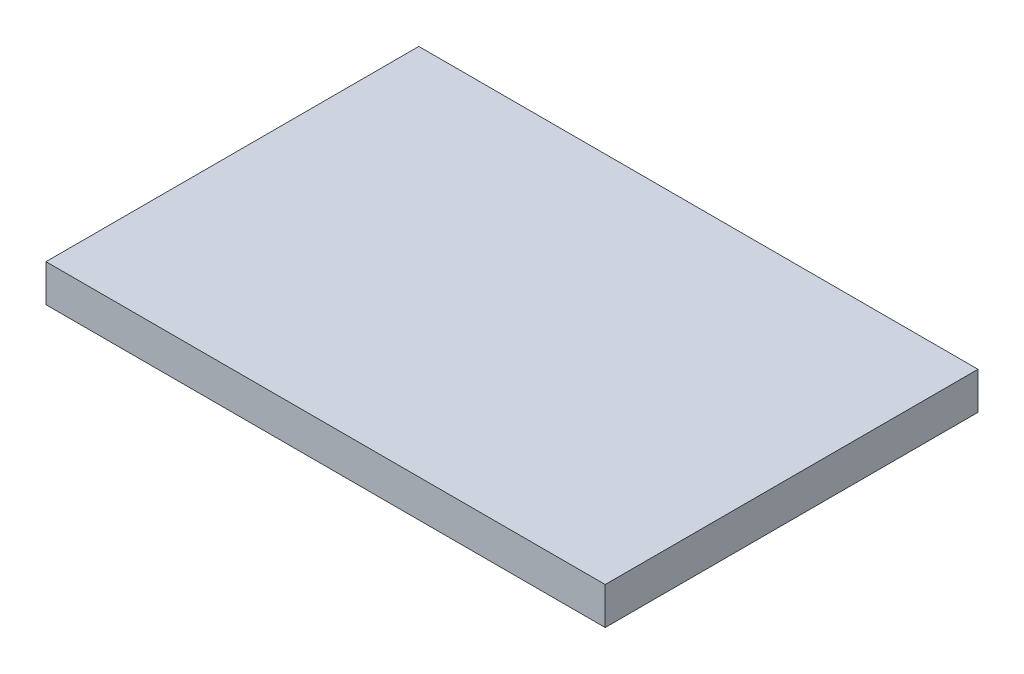
ISO-10303-21;
HEADER;
FILE_DESCRIPTION(('STEP AP214'),'2;1');
FILE_NAME('part.step','',(''),(''),'','','');
FILE_SCHEMA(('AUTOMOTIVE_DESIGN { 1 0 10303 214 1 1 1 1 }'));
ENDSEC;
DATA;
#1=APPLICATION_CONTEXT('core data for automotive mechanical design processes');
#2=APPLICATION_PROTOCOL_DEFINITION('international standard','automotive_design',2000,#1);
#3=PRODUCT_CONTEXT('',#1,'mechanical');
#4=PRODUCT('Part','Part','',(#3));
#5=PRODUCT_RELATED_PRODUCT_CATEGORY('part','',(#4));
#6=PRODUCT_DEFINITION_FORMATION('','',#4);
#7=PRODUCT_DEFINITION_CONTEXT('part definition',#1,'design');
#8=PRODUCT_DEFINITION('design','',#6,#7);
#9=PRODUCT_DEFINITION_SHAPE('','',#8);
#10=(LENGTH_UNIT() NAMED_UNIT(*) SI_UNIT(.MILLI.,.METRE.));
#11=(NAMED_UNIT(*) PLANE_ANGLE_UNIT() SI_UNIT($,.RADIAN.));
#12=(NAMED_UNIT(*) SI_UNIT($,.STERADIAN.) SOLID_ANGLE_UNIT());
#13=UNCERTAINTY_MEASURE_WITH_UNIT(LENGTH_MEASURE(1.E-05),#10,'distance_accuracy_value','');
#14=(GEOMETRIC_REPRESENTATION_CONTEXT(3) GLOBAL_UNCERTAINTY_ASSIGNED_CONTEXT((#13)) GLOBAL_UNIT_ASSIGNED_CONTEXT((#10,
#11,#12)) REPRESENTATION_CONTEXT('',''));
#15=CARTESIAN_POINT('',(0.,0.,0.));
#16=DIRECTION('',(0.,0.,1.));
#17=DIRECTION('',(1.,0.,0.));
#18=AXIS2_PLACEMENT_3D('',#15,#16,#17);
#19=CARTESIAN_POINT('',(225.,30.,-150.));
#20=DIRECTION('',(-1.,0.,0.));
#21=DIRECTION('',(0.,0.,1.));
#22=AXIS2_PLACEMENT_3D('',#19,#20,#21);
#23=PLANE('',#22);
#24=DIRECTION('',(0.,0.,-1.));
#25=VECTOR('',#24,1.);
#26=CARTESIAN_POINT('',(225.,0.,-150.));
#27=LINE('',#26,#25);
#28=CARTESIAN_POINT('',(225.,0.,150.));
#29=VERTEX_POINT('',#28);
#30=CARTESIAN_POINT('',(225.,0.,-150.));
#31=VERTEX_POINT('',#30);
#32=EDGE_CURVE('E107',#29,#31,#27,.T.);
#33=ORIENTED_EDGE('',*,*,#32,.T.);
#34=DIRECTION('',(0.,-1.,0.));
#35=VECTOR('',#34,1.);
#36=CARTESIAN_POINT('',(225.,30.,-150.));
#37=LINE('',#36,#35);
#38=CARTESIAN_POINT('',(225.,30.,-150.));
#39=VERTEX_POINT('',#38);
#40=EDGE_CURVE('E11',#39,#31,#37,.T.);
#41=ORIENTED_EDGE('',*,*,#40,.F.);
#42=DIRECTION('',(0.,0.,-1.));
#43=VECTOR('',#42,1.);
#44=CARTESIAN_POINT('',(225.,30.,-150.));
#45=LINE('',#44,#43);
#46=CARTESIAN_POINT('',(225.,30.,150.));
#47=VERTEX_POINT('',#46);
#48=EDGE_CURVE('E91',#47,#39,#45,.T.);
#49=ORIENTED_EDGE('',*,*,#48,.F.);
#50=DIRECTION('',(0.,-1.,0.));
#51=VECTOR('',#50,1.);
#52=CARTESIAN_POINT('',(225.,30.,150.));
#53=LINE('',#52,#51);
#54=EDGE_CURVE('E103',#47,#29,#53,.T.);
#55=ORIENTED_EDGE('',*,*,#54,.T.);
#56=EDGE_LOOP('',(#33,#41,#49,#55));
#57=FACE_BOUND('',#56,.T.);
#58=ADVANCED_FACE('F39',(#57),#23,.F.);
#59=CARTESIAN_POINT('',(-225.,30.,-150.));
#60=DIRECTION('',(0.,0.,1.));
#61=DIRECTION('',(1.,0.,0.));
#62=AXIS2_PLACEMENT_3D('',#59,#60,#61);
#63=PLANE('',#62);
#64=DIRECTION('',(-1.,0.,0.));
#65=VECTOR('',#64,1.);
#66=CARTESIAN_POINT('',(-225.,0.,-150.));
#67=LINE('',#66,#65);
#68=CARTESIAN_POINT('',(-225.,0.,-150.));
#69=VERTEX_POINT('',#68);
#70=EDGE_CURVE('E96',#31,#69,#67,.T.);
#71=ORIENTED_EDGE('',*,*,#70,.T.);
#72=DIRECTION('',(0.,-1.,0.));
#73=VECTOR('',#72,1.);
#74=CARTESIAN_POINT('',(-225.,30.,-150.));
#75=LINE('',#74,#73);
#76=CARTESIAN_POINT('',(-225.,30.,-150.));
#77=VERTEX_POINT('',#76);
#78=EDGE_CURVE('E48',#77,#69,#75,.T.);
#79=ORIENTED_EDGE('',*,*,#78,.F.);
#80=DIRECTION('',(-1.,0.,0.));
#81=VECTOR('',#80,1.);
#82=CARTESIAN_POINT('',(-225.,30.,-150.));
#83=LINE('',#82,#81);
#84=EDGE_CURVE('E86',#39,#77,#83,.T.);
#85=ORIENTED_EDGE('',*,*,#84,.F.);
#86=ORIENTED_EDGE('',*,*,#40,.T.);
#87=EDGE_LOOP('',(#71,#79,#85,#86));
#88=FACE_BOUND('',#87,.T.);
#89=ADVANCED_FACE('F95',(#88),#63,.F.);
#90=CARTESIAN_POINT('',(-225.,30.,-150.));
#91=DIRECTION('',(1.,0.,0.));
#92=DIRECTION('',(0.,0.,-1.));
#93=AXIS2_PLACEMENT_3D('',#90,#91,#92);
#94=PLANE('',#93);
#95=DIRECTION('',(0.,0.,1.));
#96=VECTOR('',#95,1.);
#97=CARTESIAN_POINT('',(-225.,0.,-150.));
#98=LINE('',#97,#96);
#99=CARTESIAN_POINT('',(-225.,0.,150.));
#100=VERTEX_POINT('',#99);
#101=EDGE_CURVE('E73',#69,#100,#98,.T.);
#102=ORIENTED_EDGE('',*,*,#101,.T.);
#103=DIRECTION('',(0.,-1.,0.));
#104=VECTOR('',#103,1.);
#105=CARTESIAN_POINT('',(-225.,30.,150.));
#106=LINE('',#105,#104);
#107=CARTESIAN_POINT('',(-225.,30.,150.));
#108=VERTEX_POINT('',#107);
#109=EDGE_CURVE('E98',#108,#100,#106,.T.);
#110=ORIENTED_EDGE('',*,*,#109,.F.);
#111=DIRECTION('',(0.,0.,1.));
#112=VECTOR('',#111,1.);
#113=CARTESIAN_POINT('',(-225.,30.,-150.));
#114=LINE('',#113,#112);
#115=EDGE_CURVE('E89',#77,#108,#114,.T.);
#116=ORIENTED_EDGE('',*,*,#115,.F.);
#117=ORIENTED_EDGE('',*,*,#78,.T.);
#118=EDGE_LOOP('',(#102,#110,#116,#117));
#119=FACE_BOUND('',#118,.T.);
#120=ADVANCED_FACE('F99',(#119),#94,.F.);
#121=CARTESIAN_POINT('',(-225.,30.,150.));
#122=DIRECTION('',(0.,0.,-1.));
#123=DIRECTION('',(-1.,0.,0.));
#124=AXIS2_PLACEMENT_3D('',#121,#122,#123);
#125=PLANE('',#124);
#126=DIRECTION('',(1.,0.,0.));
#127=VECTOR('',#126,1.);
#128=CARTESIAN_POINT('',(-225.,0.,150.));
#129=LINE('',#128,#127);
#130=EDGE_CURVE('E79',#100,#29,#129,.T.);
#131=ORIENTED_EDGE('',*,*,#130,.T.);
#132=ORIENTED_EDGE('',*,*,#54,.F.);
#133=DIRECTION('',(1.,0.,0.));
#134=VECTOR('',#133,1.);
#135=CARTESIAN_POINT('',(-225.,30.,150.));
#136=LINE('',#135,#134);
#137=EDGE_CURVE('E56',#108,#47,#136,.T.);
#138=ORIENTED_EDGE('',*,*,#137,.F.);
#139=ORIENTED_EDGE('',*,*,#109,.T.);
#140=EDGE_LOOP('',(#131,#132,#138,#139));
#141=FACE_BOUND('',#140,.T.);
#142=ADVANCED_FACE('F120',(#141),#125,.F.);
#143=CARTESIAN_POINT('',(0.,30.,0.));
#144=DIRECTION('',(0.,1.,0.));
#145=DIRECTION('',(0.,0.,1.));
#146=AXIS2_PLACEMENT_3D('',#143,#144,#145);
#147=PLANE('',#146);
#148=ORIENTED_EDGE('',*,*,#48,.T.);
#149=ORIENTED_EDGE('',*,*,#84,.T.);
#150=ORIENTED_EDGE('',*,*,#115,.T.);
#151=ORIENTED_EDGE('',*,*,#137,.T.);
#152=EDGE_LOOP('',(#148,#149,#150,#151));
#153=FACE_BOUND('',#152,.T.);
#154=ADVANCED_FACE('F87',(#153),#147,.T.);
#155=CARTESIAN_POINT('',(0.,0.,0.));
#156=DIRECTION('',(0.,1.,0.));
#157=DIRECTION('',(0.,0.,1.));
#158=AXIS2_PLACEMENT_3D('',#155,#156,#157);
#159=PLANE('',#158);
#160=ORIENTED_EDGE('',*,*,#32,.F.);
#161=ORIENTED_EDGE('',*,*,#130,.F.);
#162=ORIENTED_EDGE('',*,*,#101,.F.);
#163=ORIENTED_EDGE('',*,*,#70,.F.);
#164=EDGE_LOOP('',(#160,#161,#162,#163));
#165=FACE_BOUND('',#164,.T.);
#166=ADVANCED_FACE('F123',(#165),#159,.F.);
#167=CLOSED_SHELL('',(#58,#89,#120,#142,#154,#166));
#168=MANIFOLD_SOLID_BREP('B2',#167);
#169=ADVANCED_BREP_SHAPE_REPRESENTATION('',(#18,#168),#14);
#170=SHAPE_DEFINITION_REPRESENTATION(#9,#169);
ENDSEC;
END-ISO-10303-21;
